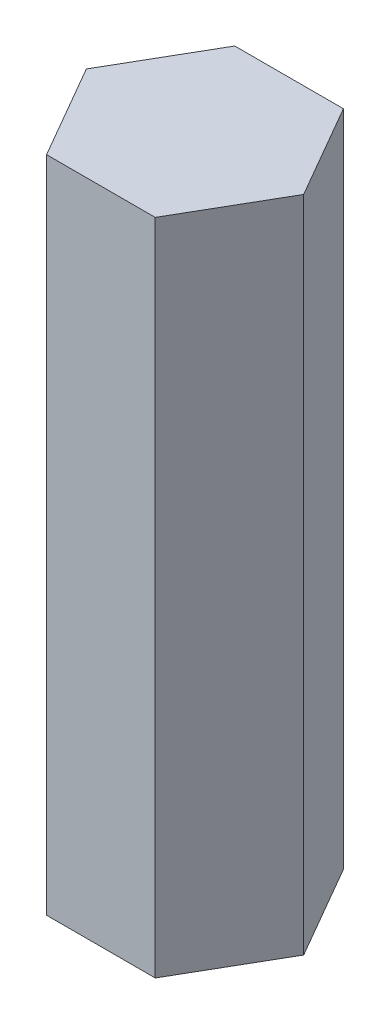
ISO-10303-21;
HEADER;
FILE_DESCRIPTION(('STEP AP214'),'2;1');
FILE_NAME('part.step','',(''),(''),'','','');
FILE_SCHEMA(('AUTOMOTIVE_DESIGN { 1 0 10303 214 1 1 1 1 }'));
ENDSEC;
DATA;
#1=APPLICATION_CONTEXT('core data for automotive mechanical design processes');
#2=APPLICATION_PROTOCOL_DEFINITION('international standard','automotive_design',2000,#1);
#3=PRODUCT_CONTEXT('',#1,'mechanical');
#4=PRODUCT('Part','Part','',(#3));
#5=PRODUCT_RELATED_PRODUCT_CATEGORY('part','',(#4));
#6=PRODUCT_DEFINITION_FORMATION('','',#4);
#7=PRODUCT_DEFINITION_CONTEXT('part definition',#1,'design');
#8=PRODUCT_DEFINITION('design','',#6,#7);
#9=PRODUCT_DEFINITION_SHAPE('','',#8);
#10=(LENGTH_UNIT() NAMED_UNIT(*) SI_UNIT(.MILLI.,.METRE.));
#11=(NAMED_UNIT(*) PLANE_ANGLE_UNIT() SI_UNIT($,.RADIAN.));
#12=(NAMED_UNIT(*) SI_UNIT($,.STERADIAN.) SOLID_ANGLE_UNIT());
#13=UNCERTAINTY_MEASURE_WITH_UNIT(LENGTH_MEASURE(1.E-05),#10,'distance_accuracy_value','');
#14=(GEOMETRIC_REPRESENTATION_CONTEXT(3) GLOBAL_UNCERTAINTY_ASSIGNED_CONTEXT((#13)) GLOBAL_UNIT_ASSIGNED_CONTEXT((#10,
#11,#12)) REPRESENTATION_CONTEXT('',''));
#15=CARTESIAN_POINT('',(0.,0.,0.));
#16=DIRECTION('',(0.,0.,1.));
#17=DIRECTION('',(1.,0.,0.));
#18=AXIS2_PLACEMENT_3D('',#15,#16,#17);
#19=CARTESIAN_POINT('',(-5.77350269189626,70.,0.));
#20=DIRECTION('',(-0.866025403784439,0.,-0.5));
#21=DIRECTION('',(-0.5,0.,0.866025403784439));
#22=AXIS2_PLACEMENT_3D('',#19,#20,#21);
#23=PLANE('',#22);
#24=DIRECTION('',(0.5,0.,-0.866025403784438));
#25=VECTOR('',#24,1.);
#26=CARTESIAN_POINT('',(-5.77350269189626,0.,0.));
#27=LINE('',#26,#25);
#28=CARTESIAN_POINT('',(-5.77350269189626,0.,0.));
#29=VERTEX_POINT('',#28);
#30=CARTESIAN_POINT('',(0.,0.,-9.99999999999999));
#31=VERTEX_POINT('',#30);
#32=EDGE_CURVE('E128',#29,#31,#27,.T.);
#33=ORIENTED_EDGE('',*,*,#32,.T.);
#34=DIRECTION('',(0.,-1.,0.));
#35=VECTOR('',#34,1.);
#36=CARTESIAN_POINT('',(0.,70.,-9.99999999999999));
#37=LINE('',#36,#35);
#38=CARTESIAN_POINT('',(0.,70.,-9.99999999999999));
#39=VERTEX_POINT('',#38);
#40=EDGE_CURVE('E11',#39,#31,#37,.T.);
#41=ORIENTED_EDGE('',*,*,#40,.F.);
#42=DIRECTION('',(0.5,0.,-0.866025403784438));
#43=VECTOR('',#42,1.);
#44=CARTESIAN_POINT('',(-5.77350269189626,70.,0.));
#45=LINE('',#44,#43);
#46=CARTESIAN_POINT('',(-5.77350269189626,70.,0.));
#47=VERTEX_POINT('',#46);
#48=EDGE_CURVE('E144',#47,#39,#45,.T.);
#49=ORIENTED_EDGE('',*,*,#48,.F.);
#50=DIRECTION('',(0.,-1.,0.));
#51=VECTOR('',#50,1.);
#52=CARTESIAN_POINT('',(-5.77350269189626,70.,0.));
#53=LINE('',#52,#51);
#54=EDGE_CURVE('E124',#47,#29,#53,.T.);
#55=ORIENTED_EDGE('',*,*,#54,.T.);
#56=EDGE_LOOP('',(#33,#41,#49,#55));
#57=FACE_BOUND('',#56,.T.);
#58=ADVANCED_FACE('F39',(#57),#23,.F.);
#59=CARTESIAN_POINT('',(0.,70.,-9.99999999999999));
#60=DIRECTION('',(-0.866025403784439,0.,0.5));
#61=DIRECTION('',(0.5,0.,0.866025403784439));
#62=AXIS2_PLACEMENT_3D('',#59,#60,#61);
#63=PLANE('',#62);
#64=DIRECTION('',(-0.5,0.,-0.866025403784439));
#65=VECTOR('',#64,1.);
#66=CARTESIAN_POINT('',(0.,0.,-9.99999999999999));
#67=LINE('',#66,#65);
#68=CARTESIAN_POINT('',(-5.77350269189627,0.,-20.));
#69=VERTEX_POINT('',#68);
#70=EDGE_CURVE('E132',#31,#69,#67,.T.);
#71=ORIENTED_EDGE('',*,*,#70,.T.);
#72=DIRECTION('',(0.,-1.,0.));
#73=VECTOR('',#72,1.);
#74=CARTESIAN_POINT('',(-5.77350269189627,70.,-20.));
#75=LINE('',#74,#73);
#76=CARTESIAN_POINT('',(-5.77350269189627,70.,-20.));
#77=VERTEX_POINT('',#76);
#78=EDGE_CURVE('E48',#77,#69,#75,.T.);
#79=ORIENTED_EDGE('',*,*,#78,.F.);
#80=DIRECTION('',(-0.5,0.,-0.866025403784439));
#81=VECTOR('',#80,1.);
#82=CARTESIAN_POINT('',(0.,70.,-9.99999999999999));
#83=LINE('',#82,#81);
#84=EDGE_CURVE('E93',#39,#77,#83,.T.);
#85=ORIENTED_EDGE('',*,*,#84,.F.);
#86=ORIENTED_EDGE('',*,*,#40,.T.);
#87=EDGE_LOOP('',(#71,#79,#85,#86));
#88=FACE_BOUND('',#87,.T.);
#89=ADVANCED_FACE('F172',(#88),#63,.F.);
#90=CARTESIAN_POINT('',(-5.77350269189627,70.,-20.));
#91=DIRECTION('',(0.,0.,1.));
#92=DIRECTION('',(1.,0.,0.));
#93=AXIS2_PLACEMENT_3D('',#90,#91,#92);
#94=PLANE('',#93);
#95=DIRECTION('',(-1.,0.,0.));
#96=VECTOR('',#95,1.);
#97=CARTESIAN_POINT('',(-5.77350269189627,0.,-20.));
#98=LINE('',#97,#96);
#99=CARTESIAN_POINT('',(-17.3205080756888,0.,-20.));
#100=VERTEX_POINT('',#99);
#101=EDGE_CURVE('E135',#69,#100,#98,.T.);
#102=ORIENTED_EDGE('',*,*,#101,.T.);
#103=DIRECTION('',(0.,-1.,0.));
#104=VECTOR('',#103,1.);
#105=CARTESIAN_POINT('',(-17.3205080756888,70.,-20.));
#106=LINE('',#105,#104);
#107=CARTESIAN_POINT('',(-17.3205080756888,70.,-20.));
#108=VERTEX_POINT('',#107);
#109=EDGE_CURVE('E117',#108,#100,#106,.T.);
#110=ORIENTED_EDGE('',*,*,#109,.F.);
#111=DIRECTION('',(-1.,0.,0.));
#112=VECTOR('',#111,1.);
#113=CARTESIAN_POINT('',(-5.77350269189627,70.,-20.));
#114=LINE('',#113,#112);
#115=EDGE_CURVE('E106',#77,#108,#114,.T.);
#116=ORIENTED_EDGE('',*,*,#115,.F.);
#117=ORIENTED_EDGE('',*,*,#78,.T.);
#118=EDGE_LOOP('',(#102,#110,#116,#117));
#119=FACE_BOUND('',#118,.T.);
#120=ADVANCED_FACE('F154',(#119),#94,.F.);
#121=CARTESIAN_POINT('',(-17.3205080756888,70.,-20.));
#122=DIRECTION('',(0.866025403784439,0.,0.5));
#123=DIRECTION('',(0.5,0.,-0.866025403784439));
#124=AXIS2_PLACEMENT_3D('',#121,#122,#123);
#125=PLANE('',#124);
#126=DIRECTION('',(-0.5,0.,0.866025403784439));
#127=VECTOR('',#126,1.);
#128=CARTESIAN_POINT('',(-17.3205080756888,0.,-20.));
#129=LINE('',#128,#127);
#130=CARTESIAN_POINT('',(-23.094010767585,0.,-10.));
#131=VERTEX_POINT('',#130);
#132=EDGE_CURVE('E115',#100,#131,#129,.T.);
#133=ORIENTED_EDGE('',*,*,#132,.T.);
#134=DIRECTION('',(0.,-1.,0.));
#135=VECTOR('',#134,1.);
#136=CARTESIAN_POINT('',(-23.094010767585,70.,-10.));
#137=LINE('',#136,#135);
#138=CARTESIAN_POINT('',(-23.094010767585,70.,-10.));
#139=VERTEX_POINT('',#138);
#140=EDGE_CURVE('E112',#139,#131,#137,.T.);
#141=ORIENTED_EDGE('',*,*,#140,.F.);
#142=DIRECTION('',(-0.5,0.,0.866025403784439));
#143=VECTOR('',#142,1.);
#144=CARTESIAN_POINT('',(-17.3205080756888,70.,-20.));
#145=LINE('',#144,#143);
#146=EDGE_CURVE('E100',#108,#139,#145,.T.);
#147=ORIENTED_EDGE('',*,*,#146,.F.);
#148=ORIENTED_EDGE('',*,*,#109,.T.);
#149=EDGE_LOOP('',(#133,#141,#147,#148));
#150=FACE_BOUND('',#149,.T.);
#151=ADVANCED_FACE('F113',(#150),#125,.F.);
#152=CARTESIAN_POINT('',(-23.094010767585,70.,-10.));
#153=DIRECTION('',(0.866025403784439,0.,-0.5));
#154=DIRECTION('',(-0.5,0.,-0.866025403784439));
#155=AXIS2_PLACEMENT_3D('',#152,#153,#154);
#156=PLANE('',#155);
#157=DIRECTION('',(0.5,0.,0.866025403784439));
#158=VECTOR('',#157,1.);
#159=CARTESIAN_POINT('',(-23.094010767585,0.,-10.));
#160=LINE('',#159,#158);
#161=CARTESIAN_POINT('',(-17.3205080756888,0.,0.));
#162=VERTEX_POINT('',#161);
#163=EDGE_CURVE('E79',#131,#162,#160,.T.);
#164=ORIENTED_EDGE('',*,*,#163,.T.);
#165=DIRECTION('',(0.,-1.,0.));
#166=VECTOR('',#165,1.);
#167=CARTESIAN_POINT('',(-17.3205080756888,70.,0.));
#168=LINE('',#167,#166);
#169=CARTESIAN_POINT('',(-17.3205080756888,70.,0.));
#170=VERTEX_POINT('',#169);
#171=EDGE_CURVE('E118',#170,#162,#168,.T.);
#172=ORIENTED_EDGE('',*,*,#171,.F.);
#173=DIRECTION('',(0.5,0.,0.866025403784439));
#174=VECTOR('',#173,1.);
#175=CARTESIAN_POINT('',(-23.094010767585,70.,-10.));
#176=LINE('',#175,#174);
#177=EDGE_CURVE('E104',#139,#170,#176,.T.);
#178=ORIENTED_EDGE('',*,*,#177,.F.);
#179=ORIENTED_EDGE('',*,*,#140,.T.);
#180=EDGE_LOOP('',(#164,#172,#178,#179));
#181=FACE_BOUND('',#180,.T.);
#182=ADVANCED_FACE('F120',(#181),#156,.F.);
#183=CARTESIAN_POINT('',(-17.3205080756888,70.,0.));
#184=DIRECTION('',(0.,0.,-1.));
#185=DIRECTION('',(-1.,0.,0.));
#186=AXIS2_PLACEMENT_3D('',#183,#184,#185);
#187=PLANE('',#186);
#188=DIRECTION('',(1.,0.,0.));
#189=VECTOR('',#188,1.);
#190=CARTESIAN_POINT('',(-17.3205080756888,0.,0.));
#191=LINE('',#190,#189);
#192=EDGE_CURVE('E85',#162,#29,#191,.T.);
#193=ORIENTED_EDGE('',*,*,#192,.T.);
#194=ORIENTED_EDGE('',*,*,#54,.F.);
#195=DIRECTION('',(1.,0.,0.));
#196=VECTOR('',#195,1.);
#197=CARTESIAN_POINT('',(-17.3205080756888,70.,0.));
#198=LINE('',#197,#196);
#199=EDGE_CURVE('E56',#170,#47,#198,.T.);
#200=ORIENTED_EDGE('',*,*,#199,.F.);
#201=ORIENTED_EDGE('',*,*,#171,.T.);
#202=EDGE_LOOP('',(#193,#194,#200,#201));
#203=FACE_BOUND('',#202,.T.);
#204=ADVANCED_FACE('F161',(#203),#187,.F.);
#205=CARTESIAN_POINT('',(0.,70.,0.));
#206=DIRECTION('',(0.,1.,0.));
#207=DIRECTION('',(0.,0.,1.));
#208=AXIS2_PLACEMENT_3D('',#205,#206,#207);
#209=PLANE('',#208);
#210=ORIENTED_EDGE('',*,*,#48,.T.);
#211=ORIENTED_EDGE('',*,*,#84,.T.);
#212=ORIENTED_EDGE('',*,*,#115,.T.);
#213=ORIENTED_EDGE('',*,*,#146,.T.);
#214=ORIENTED_EDGE('',*,*,#177,.T.);
#215=ORIENTED_EDGE('',*,*,#199,.T.);
#216=EDGE_LOOP('',(#210,#211,#212,#213,#214,#215));
#217=FACE_BOUND('',#216,.T.);
#218=ADVANCED_FACE('F102',(#217),#209,.T.);
#219=CARTESIAN_POINT('',(0.,0.,0.));
#220=DIRECTION('',(0.,1.,0.));
#221=DIRECTION('',(0.,0.,1.));
#222=AXIS2_PLACEMENT_3D('',#219,#220,#221);
#223=PLANE('',#222);
#224=ORIENTED_EDGE('',*,*,#32,.F.);
#225=ORIENTED_EDGE('',*,*,#192,.F.);
#226=ORIENTED_EDGE('',*,*,#163,.F.);
#227=ORIENTED_EDGE('',*,*,#132,.F.);
#228=ORIENTED_EDGE('',*,*,#101,.F.);
#229=ORIENTED_EDGE('',*,*,#70,.F.);
#230=EDGE_LOOP('',(#224,#225,#226,#227,#228,#229));
#231=FACE_BOUND('',#230,.T.);
#232=ADVANCED_FACE('F157',(#231),#223,.F.);
#233=CLOSED_SHELL('',(#58,#89,#120,#151,#182,#204,#218,#232));
#234=MANIFOLD_SOLID_BREP('B2',#233);
#235=ADVANCED_BREP_SHAPE_REPRESENTATION('',(#18,#234),#14);
#236=SHAPE_DEFINITION_REPRESENTATION(#9,#235);
ENDSEC;
END-ISO-10303-21;
